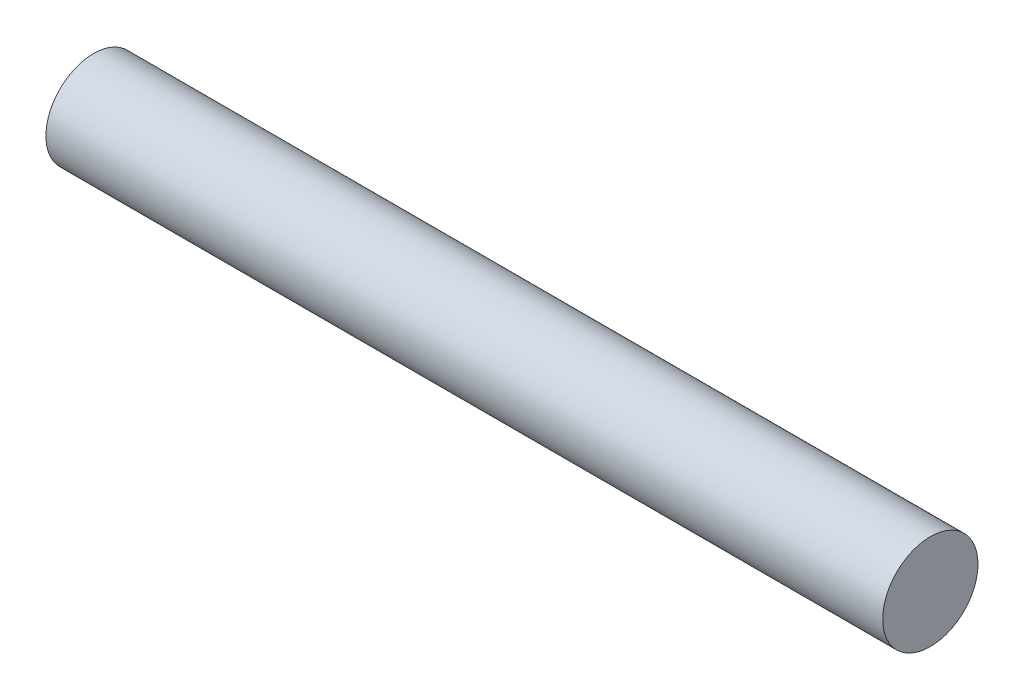
ISO-10303-21;
HEADER;
FILE_DESCRIPTION(('STEP AP214'),'2;1');
FILE_NAME('part.step','',(''),(''),'','','');
FILE_SCHEMA(('AUTOMOTIVE_DESIGN { 1 0 10303 214 1 1 1 1 }'));
ENDSEC;
DATA;
#1=APPLICATION_CONTEXT('core data for automotive mechanical design processes');
#2=APPLICATION_PROTOCOL_DEFINITION('international standard','automotive_design',2000,#1);
#3=PRODUCT_CONTEXT('',#1,'mechanical');
#4=PRODUCT('Part','Part','',(#3));
#5=PRODUCT_RELATED_PRODUCT_CATEGORY('part','',(#4));
#6=PRODUCT_DEFINITION_FORMATION('','',#4);
#7=PRODUCT_DEFINITION_CONTEXT('part definition',#1,'design');
#8=PRODUCT_DEFINITION('design','',#6,#7);
#9=PRODUCT_DEFINITION_SHAPE('','',#8);
#10=(LENGTH_UNIT() NAMED_UNIT(*) SI_UNIT(.MILLI.,.METRE.));
#11=(NAMED_UNIT(*) PLANE_ANGLE_UNIT() SI_UNIT($,.RADIAN.));
#12=(NAMED_UNIT(*) SI_UNIT($,.STERADIAN.) SOLID_ANGLE_UNIT());
#13=UNCERTAINTY_MEASURE_WITH_UNIT(LENGTH_MEASURE(1.E-05),#10,'distance_accuracy_value','');
#14=(GEOMETRIC_REPRESENTATION_CONTEXT(3) GLOBAL_UNCERTAINTY_ASSIGNED_CONTEXT((#13)) GLOBAL_UNIT_ASSIGNED_CONTEXT((#10,
#11,#12)) REPRESENTATION_CONTEXT('',''));
#15=CARTESIAN_POINT('',(0.,0.,0.));
#16=DIRECTION('',(0.,0.,1.));
#17=DIRECTION('',(1.,0.,0.));
#18=AXIS2_PLACEMENT_3D('',#15,#16,#17);
#19=CARTESIAN_POINT('',(87.8,0.,0.));
#20=DIRECTION('',(-1.,0.,0.));
#21=DIRECTION('',(0.,0.,1.));
#22=AXIS2_PLACEMENT_3D('',#19,#20,#21);
#23=CYLINDRICAL_SURFACE('',#22,5.);
#24=CARTESIAN_POINT('',(87.8,0.,0.));
#25=DIRECTION('',(1.,0.,0.));
#26=DIRECTION('',(0.,0.,-1.));
#27=AXIS2_PLACEMENT_3D('',#24,#25,#26);
#28=CIRCLE('',#27,5.);
#29=CARTESIAN_POINT('',(87.8,0.,-5.));
#30=VERTEX_POINT('',#29);
#31=EDGE_CURVE('E10',#30,#30,#28,.T.);
#32=ORIENTED_EDGE('',*,*,#31,.F.);
#33=EDGE_LOOP('',(#32));
#34=FACE_BOUND('',#33,.T.);
#35=CARTESIAN_POINT('',(0.,0.,0.));
#36=DIRECTION('',(1.,0.,0.));
#37=DIRECTION('',(0.,0.,-1.));
#38=AXIS2_PLACEMENT_3D('',#35,#36,#37);
#39=CIRCLE('',#38,5.);
#40=CARTESIAN_POINT('',(0.,0.,-5.));
#41=VERTEX_POINT('',#40);
#42=EDGE_CURVE('E38',#41,#41,#39,.T.);
#43=ORIENTED_EDGE('',*,*,#42,.T.);
#44=EDGE_LOOP('',(#43));
#45=FACE_BOUND('',#44,.T.);
#46=ADVANCED_FACE('F35',(#34,#45),#23,.T.);
#47=CARTESIAN_POINT('',(87.8,0.,0.));
#48=DIRECTION('',(1.,0.,0.));
#49=DIRECTION('',(0.,0.,-1.));
#50=AXIS2_PLACEMENT_3D('',#47,#48,#49);
#51=PLANE('',#50);
#52=ORIENTED_EDGE('',*,*,#31,.T.);
#53=EDGE_LOOP('',(#52));
#54=FACE_BOUND('',#53,.T.);
#55=ADVANCED_FACE('F50',(#54),#51,.T.);
#56=CARTESIAN_POINT('',(0.,0.,0.));
#57=DIRECTION('',(1.,0.,0.));
#58=DIRECTION('',(0.,0.,-1.));
#59=AXIS2_PLACEMENT_3D('',#56,#57,#58);
#60=PLANE('',#59);
#61=ORIENTED_EDGE('',*,*,#42,.F.);
#62=EDGE_LOOP('',(#61));
#63=FACE_BOUND('',#62,.T.);
#64=ADVANCED_FACE('F48',(#63),#60,.F.);
#65=CLOSED_SHELL('',(#46,#55,#64));
#66=MANIFOLD_SOLID_BREP('B2',#65);
#67=ADVANCED_BREP_SHAPE_REPRESENTATION('',(#18,#66),#14);
#68=SHAPE_DEFINITION_REPRESENTATION(#9,#67);
ENDSEC;
END-ISO-10303-21;
